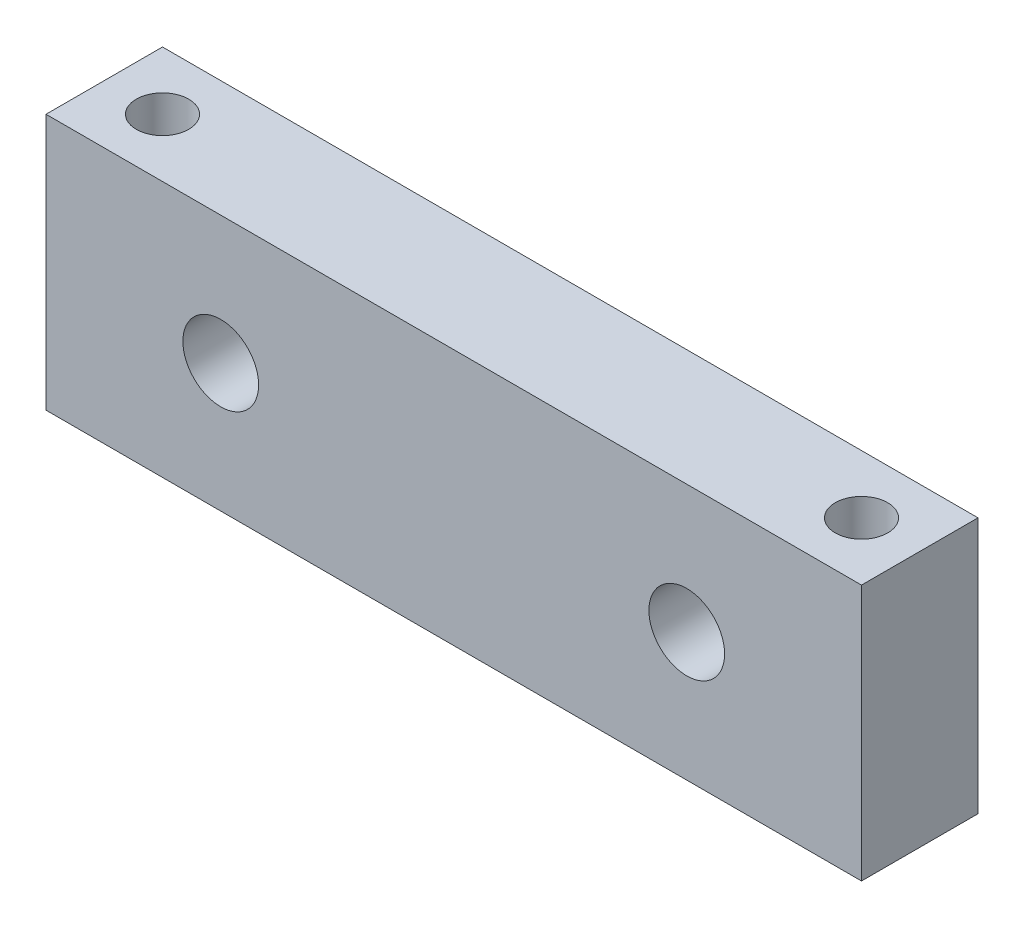
ISO-10303-21;
HEADER;
FILE_DESCRIPTION(('STEP AP214'),'2;1');
FILE_NAME('part.step','',(''),(''),'','','');
FILE_SCHEMA(('AUTOMOTIVE_DESIGN { 1 0 10303 214 1 1 1 1 }'));
ENDSEC;
DATA;
#1=APPLICATION_CONTEXT('core data for automotive mechanical design processes');
#2=APPLICATION_PROTOCOL_DEFINITION('international standard','automotive_design',2000,#1);
#3=PRODUCT_CONTEXT('',#1,'mechanical');
#4=PRODUCT('Part','Part','',(#3));
#5=PRODUCT_RELATED_PRODUCT_CATEGORY('part','',(#4));
#6=PRODUCT_DEFINITION_FORMATION('','',#4);
#7=PRODUCT_DEFINITION_CONTEXT('part definition',#1,'design');
#8=PRODUCT_DEFINITION('design','',#6,#7);
#9=PRODUCT_DEFINITION_SHAPE('','',#8);
#10=(LENGTH_UNIT() NAMED_UNIT(*) SI_UNIT(.MILLI.,.METRE.));
#11=(NAMED_UNIT(*) PLANE_ANGLE_UNIT() SI_UNIT($,.RADIAN.));
#12=(NAMED_UNIT(*) SI_UNIT($,.STERADIAN.) SOLID_ANGLE_UNIT());
#13=UNCERTAINTY_MEASURE_WITH_UNIT(LENGTH_MEASURE(1.E-05),#10,'distance_accuracy_value','');
#14=(GEOMETRIC_REPRESENTATION_CONTEXT(3) GLOBAL_UNCERTAINTY_ASSIGNED_CONTEXT((#13)) GLOBAL_UNIT_ASSIGNED_CONTEXT((#10,
#11,#12)) REPRESENTATION_CONTEXT('',''));
#15=CARTESIAN_POINT('',(0.,0.,0.));
#16=DIRECTION('',(0.,0.,1.));
#17=DIRECTION('',(1.,0.,0.));
#18=AXIS2_PLACEMENT_3D('',#15,#16,#17);
#19=CARTESIAN_POINT('',(30.,-34.,5.));
#20=DIRECTION('',(0.,1.,0.));
#21=DIRECTION('',(0.,0.,1.));
#22=AXIS2_PLACEMENT_3D('',#19,#20,#21);
#23=CYLINDRICAL_SURFACE('',#22,2.25);
#24=CARTESIAN_POINT('',(30.,11.,5.));
#25=DIRECTION('',(0.,1.,0.));
#26=DIRECTION('',(0.,0.,-1.));
#27=AXIS2_PLACEMENT_3D('',#24,#25,#26);
#28=CIRCLE('',#27,2.25);
#29=CARTESIAN_POINT('',(30.,11.,7.25));
#30=VERTEX_POINT('',#29);
#31=EDGE_CURVE('E188',#30,#30,#28,.T.);
#32=CARTESIAN_POINT('',(30.,-7.,5.));
#33=DIRECTION('',(0.,-1.,0.));
#34=DIRECTION('',(0.,0.,-1.));
#35=AXIS2_PLACEMENT_3D('',#32,#33,#34);
#36=CIRCLE('',#35,2.25);
#37=CARTESIAN_POINT('',(30.,-7.,7.25));
#38=VERTEX_POINT('',#37);
#39=EDGE_CURVE('E43',#38,#38,#36,.F.);
#40=CARTESIAN_POINT('',(30.,11.,7.25));
#41=CARTESIAN_POINT('',(30.,10.8125,7.25));
#42=CARTESIAN_POINT('',(30.,10.625,7.25));
#43=CARTESIAN_POINT('',(30.,10.25,7.25));
#44=CARTESIAN_POINT('',(30.,10.0625,7.25));
#45=CARTESIAN_POINT('',(30.,9.68749999999999,7.25));
#46=CARTESIAN_POINT('',(30.,9.49999999999999,7.25));
#47=CARTESIAN_POINT('',(30.,9.12499999999999,7.25));
#48=CARTESIAN_POINT('',(30.,8.93749999999999,7.25));
#49=CARTESIAN_POINT('',(30.,8.56249999999999,7.25));
#50=CARTESIAN_POINT('',(30.,8.375,7.25));
#51=CARTESIAN_POINT('',(30.,8.,7.25));
#52=CARTESIAN_POINT('',(30.,7.8125,7.25));
#53=CARTESIAN_POINT('',(30.,7.4375,7.25));
#54=CARTESIAN_POINT('',(30.,7.25,7.25));
#55=CARTESIAN_POINT('',(30.,6.875,7.25));
#56=CARTESIAN_POINT('',(30.,6.6875,7.25));
#57=CARTESIAN_POINT('',(30.,6.3125,7.25));
#58=CARTESIAN_POINT('',(30.,6.125,7.25));
#59=CARTESIAN_POINT('',(30.,5.75,7.25));
#60=CARTESIAN_POINT('',(30.,5.5625,7.25));
#61=CARTESIAN_POINT('',(30.,5.1875,7.25));
#62=CARTESIAN_POINT('',(30.,5.,7.25));
#63=CARTESIAN_POINT('',(30.,4.625,7.25));
#64=CARTESIAN_POINT('',(30.,4.4375,7.25));
#65=CARTESIAN_POINT('',(30.,4.0625,7.25));
#66=CARTESIAN_POINT('',(30.,3.875,7.25));
#67=CARTESIAN_POINT('',(30.,3.5,7.25));
#68=CARTESIAN_POINT('',(30.,3.3125,7.25));
#69=CARTESIAN_POINT('',(30.,2.9375,7.25));
#70=CARTESIAN_POINT('',(30.,2.75,7.25));
#71=CARTESIAN_POINT('',(30.,2.375,7.25));
#72=CARTESIAN_POINT('',(30.,2.1875,7.25));
#73=CARTESIAN_POINT('',(30.,1.8125,7.25));
#74=CARTESIAN_POINT('',(30.,1.625,7.25));
#75=CARTESIAN_POINT('',(30.,1.25,7.25));
#76=CARTESIAN_POINT('',(30.,1.0625,7.25));
#77=CARTESIAN_POINT('',(30.,0.687500000000001,7.25));
#78=CARTESIAN_POINT('',(30.,0.5,7.25));
#79=CARTESIAN_POINT('',(30.,0.125,7.25));
#80=CARTESIAN_POINT('',(30.,-0.0625,7.25));
#81=CARTESIAN_POINT('',(30.,-0.4375,7.25));
#82=CARTESIAN_POINT('',(30.,-0.625000000000001,7.25));
#83=CARTESIAN_POINT('',(30.,-1.,7.25));
#84=CARTESIAN_POINT('',(30.,-1.1875,7.25));
#85=CARTESIAN_POINT('',(30.,-1.5625,7.25));
#86=CARTESIAN_POINT('',(30.,-1.75,7.25));
#87=CARTESIAN_POINT('',(30.,-2.125,7.25));
#88=CARTESIAN_POINT('',(30.,-2.3125,7.25));
#89=CARTESIAN_POINT('',(30.,-2.6875,7.25));
#90=CARTESIAN_POINT('',(30.,-2.875,7.25));
#91=CARTESIAN_POINT('',(30.,-3.25,7.25));
#92=CARTESIAN_POINT('',(30.,-3.4375,7.25));
#93=CARTESIAN_POINT('',(30.,-3.8125,7.25));
#94=CARTESIAN_POINT('',(30.,-4.,7.25));
#95=CARTESIAN_POINT('',(30.,-4.375,7.25));
#96=CARTESIAN_POINT('',(30.,-4.5625,7.25));
#97=CARTESIAN_POINT('',(30.,-4.9375,7.25));
#98=CARTESIAN_POINT('',(30.,-5.125,7.25));
#99=CARTESIAN_POINT('',(30.,-5.5,7.25));
#100=CARTESIAN_POINT('',(30.,-5.6875,7.25));
#101=CARTESIAN_POINT('',(30.,-6.06249999999999,7.25));
#102=CARTESIAN_POINT('',(30.,-6.25,7.25));
#103=CARTESIAN_POINT('',(30.,-6.625,7.25));
#104=CARTESIAN_POINT('',(30.,-6.8125,7.25));
#105=CARTESIAN_POINT('',(30.,-7.,7.25));
#106=B_SPLINE_CURVE_WITH_KNOTS('',3,(#40,#41,#42,#43,#44,#45,#46,#47,#48,#49,#50,#51,#52,#53,
#54,#55,#56,#57,#58,#59,#60,#61,#62,#63,#64,#65,#66,#67,#68,#69,#70,#71,#72,#73,#74,#75,#76,#77,
#78,#79,#80,#81,#82,#83,#84,#85,#86,#87,#88,#89,#90,#91,#92,#93,#94,#95,#96,#97,#98,#99,#100,
#101,#102,#103,#104,#105),.UNSPECIFIED.,.F.,.F.,(4,2,2,2,2,2,2,2,2,2,2,2,2,2,2,2,2,2,2,2,2,2,2,
2,2,2,2,2,2,2,2,2,4),(0.,0.5625,1.125,1.6875,2.25,2.8125,3.375,3.9375,4.5,5.0625,5.625,6.1875,
6.75,7.3125,7.875,8.4375,8.99999999999999,9.5625,10.125,10.6875,11.25,11.8125,12.375,12.9375,
13.5,14.0625,14.625,15.1875,15.75,16.3125,16.875,17.4375,18.),.UNSPECIFIED.);
#107=EDGE_CURVE('BSEAM39',#30,#38,#106,.T.);
#108=ORIENTED_EDGE('',*,*,#31,.T.);
#109=ORIENTED_EDGE('',*,*,#39,.F.);
#110=ORIENTED_EDGE('',*,*,#107,.T.);
#111=ORIENTED_EDGE('',*,*,#107,.F.);
#112=EDGE_LOOP('',(#108,#110,#109,#111));
#113=FACE_BOUND('',#112,.T.);
#114=ADVANCED_FACE('F39',(#113),#23,.F.);
#115=CARTESIAN_POINT('',(-30.,-34.,5.));
#116=DIRECTION('',(0.,1.,0.));
#117=DIRECTION('',(0.,0.,1.));
#118=AXIS2_PLACEMENT_3D('',#115,#116,#117);
#119=CYLINDRICAL_SURFACE('',#118,2.25);
#120=CARTESIAN_POINT('',(-30.,11.,5.));
#121=DIRECTION('',(0.,1.,0.));
#122=DIRECTION('',(0.,0.,1.));
#123=AXIS2_PLACEMENT_3D('',#120,#121,#122);
#124=CIRCLE('',#123,2.25);
#125=CARTESIAN_POINT('',(-30.,11.,7.25));
#126=VERTEX_POINT('',#125);
#127=EDGE_CURVE('E115',#126,#126,#124,.T.);
#128=CARTESIAN_POINT('',(-30.,-7.,5.));
#129=DIRECTION('',(0.,-1.,0.));
#130=DIRECTION('',(0.,0.,-1.));
#131=AXIS2_PLACEMENT_3D('',#128,#129,#130);
#132=CIRCLE('',#131,2.25);
#133=CARTESIAN_POINT('',(-30.,-7.,7.25));
#134=VERTEX_POINT('',#133);
#135=EDGE_CURVE('E125',#134,#134,#132,.F.);
#136=CARTESIAN_POINT('',(-30.,11.,7.25));
#137=CARTESIAN_POINT('',(-30.,10.8125,7.25));
#138=CARTESIAN_POINT('',(-30.,10.625,7.25));
#139=CARTESIAN_POINT('',(-30.,10.25,7.25));
#140=CARTESIAN_POINT('',(-30.,10.0625,7.25));
#141=CARTESIAN_POINT('',(-30.,9.68749999999999,7.25));
#142=CARTESIAN_POINT('',(-30.,9.49999999999999,7.25));
#143=CARTESIAN_POINT('',(-30.,9.12499999999999,7.25));
#144=CARTESIAN_POINT('',(-30.,8.93749999999999,7.25));
#145=CARTESIAN_POINT('',(-30.,8.56249999999999,7.25));
#146=CARTESIAN_POINT('',(-30.,8.375,7.25));
#147=CARTESIAN_POINT('',(-30.,8.,7.25));
#148=CARTESIAN_POINT('',(-30.,7.8125,7.25));
#149=CARTESIAN_POINT('',(-30.,7.4375,7.25));
#150=CARTESIAN_POINT('',(-30.,7.25,7.25));
#151=CARTESIAN_POINT('',(-30.,6.875,7.25));
#152=CARTESIAN_POINT('',(-30.,6.6875,7.25));
#153=CARTESIAN_POINT('',(-30.,6.3125,7.25));
#154=CARTESIAN_POINT('',(-30.,6.125,7.25));
#155=CARTESIAN_POINT('',(-30.,5.75,7.25));
#156=CARTESIAN_POINT('',(-30.,5.5625,7.25));
#157=CARTESIAN_POINT('',(-30.,5.1875,7.25));
#158=CARTESIAN_POINT('',(-30.,5.,7.25));
#159=CARTESIAN_POINT('',(-30.,4.625,7.25));
#160=CARTESIAN_POINT('',(-30.,4.4375,7.25));
#161=CARTESIAN_POINT('',(-30.,4.0625,7.25));
#162=CARTESIAN_POINT('',(-30.,3.875,7.25));
#163=CARTESIAN_POINT('',(-30.,3.5,7.25));
#164=CARTESIAN_POINT('',(-30.,3.3125,7.25));
#165=CARTESIAN_POINT('',(-30.,2.9375,7.25));
#166=CARTESIAN_POINT('',(-30.,2.75,7.25));
#167=CARTESIAN_POINT('',(-30.,2.375,7.25));
#168=CARTESIAN_POINT('',(-30.,2.1875,7.25));
#169=CARTESIAN_POINT('',(-30.,1.8125,7.25));
#170=CARTESIAN_POINT('',(-30.,1.625,7.25));
#171=CARTESIAN_POINT('',(-30.,1.25,7.25));
#172=CARTESIAN_POINT('',(-30.,1.0625,7.25));
#173=CARTESIAN_POINT('',(-30.,0.687500000000001,7.25));
#174=CARTESIAN_POINT('',(-30.,0.5,7.25));
#175=CARTESIAN_POINT('',(-30.,0.125,7.25));
#176=CARTESIAN_POINT('',(-30.,-0.0625,7.25));
#177=CARTESIAN_POINT('',(-30.,-0.4375,7.25));
#178=CARTESIAN_POINT('',(-30.,-0.625000000000001,7.25));
#179=CARTESIAN_POINT('',(-30.,-1.,7.25));
#180=CARTESIAN_POINT('',(-30.,-1.1875,7.25));
#181=CARTESIAN_POINT('',(-30.,-1.5625,7.25));
#182=CARTESIAN_POINT('',(-30.,-1.75,7.25));
#183=CARTESIAN_POINT('',(-30.,-2.125,7.25));
#184=CARTESIAN_POINT('',(-30.,-2.3125,7.25));
#185=CARTESIAN_POINT('',(-30.,-2.6875,7.25));
#186=CARTESIAN_POINT('',(-30.,-2.875,7.25));
#187=CARTESIAN_POINT('',(-30.,-3.25,7.25));
#188=CARTESIAN_POINT('',(-30.,-3.4375,7.25));
#189=CARTESIAN_POINT('',(-30.,-3.8125,7.25));
#190=CARTESIAN_POINT('',(-30.,-4.,7.25));
#191=CARTESIAN_POINT('',(-30.,-4.375,7.25));
#192=CARTESIAN_POINT('',(-30.,-4.5625,7.25));
#193=CARTESIAN_POINT('',(-30.,-4.9375,7.25));
#194=CARTESIAN_POINT('',(-30.,-5.125,7.25));
#195=CARTESIAN_POINT('',(-30.,-5.5,7.25));
#196=CARTESIAN_POINT('',(-30.,-5.6875,7.25));
#197=CARTESIAN_POINT('',(-30.,-6.06249999999999,7.25));
#198=CARTESIAN_POINT('',(-30.,-6.25,7.25));
#199=CARTESIAN_POINT('',(-30.,-6.625,7.25));
#200=CARTESIAN_POINT('',(-30.,-6.8125,7.25));
#201=CARTESIAN_POINT('',(-30.,-7.,7.25));
#202=B_SPLINE_CURVE_WITH_KNOTS('',3,(#136,#137,#138,#139,#140,#141,#142,#143,#144,#145,#146,
#147,#148,#149,#150,#151,#152,#153,#154,#155,#156,#157,#158,#159,#160,#161,#162,#163,#164,#165,
#166,#167,#168,#169,#170,#171,#172,#173,#174,#175,#176,#177,#178,#179,#180,#181,#182,#183,#184,
#185,#186,#187,#188,#189,#190,#191,#192,#193,#194,#195,#196,#197,#198,#199,#200,#201),
.UNSPECIFIED.,.F.,.F.,(4,2,2,2,2,2,2,2,2,2,2,2,2,2,2,2,2,2,2,2,2,2,2,2,2,2,2,2,2,2,2,2,4),(0.,
0.5625,1.125,1.6875,2.25,2.8125,3.375,3.9375,4.5,5.0625,5.625,6.1875,6.75,7.3125,7.875,8.4375,
8.99999999999999,9.5625,10.125,10.6875,11.25,11.8125,12.375,12.9375,13.5,14.0625,14.625,15.1875,
15.75,16.3125,16.875,17.4375,18.),.UNSPECIFIED.);
#203=EDGE_CURVE('BSEAM214',#126,#134,#202,.T.);
#204=ORIENTED_EDGE('',*,*,#127,.T.);
#205=ORIENTED_EDGE('',*,*,#135,.F.);
#206=ORIENTED_EDGE('',*,*,#203,.T.);
#207=ORIENTED_EDGE('',*,*,#203,.F.);
#208=EDGE_LOOP('',(#204,#206,#205,#207));
#209=FACE_BOUND('',#208,.T.);
#210=ADVANCED_FACE('F214',(#209),#119,.F.);
#211=CARTESIAN_POINT('',(0.,0.,0.));
#212=DIRECTION('',(0.,0.,-1.));
#213=DIRECTION('',(-1.,0.,0.));
#214=AXIS2_PLACEMENT_3D('',#211,#212,#213);
#215=PLANE('',#214);
#216=DIRECTION('',(0.,1.,0.));
#217=VECTOR('',#216,1.);
#218=CARTESIAN_POINT('',(35.,-11.,0.));
#219=LINE('',#218,#217);
#220=CARTESIAN_POINT('',(35.,-11.,0.));
#221=VERTEX_POINT('',#220);
#222=CARTESIAN_POINT('',(35.,11.,0.));
#223=VERTEX_POINT('',#222);
#224=EDGE_CURVE('E111',#221,#223,#219,.T.);
#225=ORIENTED_EDGE('',*,*,#224,.F.);
#226=DIRECTION('',(1.,0.,0.));
#227=VECTOR('',#226,1.);
#228=CARTESIAN_POINT('',(-35.,-11.,0.));
#229=LINE('',#228,#227);
#230=CARTESIAN_POINT('',(-35.,-11.,0.));
#231=VERTEX_POINT('',#230);
#232=EDGE_CURVE('E82',#231,#221,#229,.T.);
#233=ORIENTED_EDGE('',*,*,#232,.F.);
#234=DIRECTION('',(0.,-1.,0.));
#235=VECTOR('',#234,1.);
#236=CARTESIAN_POINT('',(-35.,-11.,0.));
#237=LINE('',#236,#235);
#238=CARTESIAN_POINT('',(-35.,11.,0.));
#239=VERTEX_POINT('',#238);
#240=EDGE_CURVE('E76',#239,#231,#237,.T.);
#241=ORIENTED_EDGE('',*,*,#240,.F.);
#242=DIRECTION('',(-1.,0.,0.));
#243=VECTOR('',#242,1.);
#244=CARTESIAN_POINT('',(-35.,11.,0.));
#245=LINE('',#244,#243);
#246=EDGE_CURVE('E99',#223,#239,#245,.T.);
#247=ORIENTED_EDGE('',*,*,#246,.F.);
#248=EDGE_LOOP('',(#225,#233,#241,#247));
#249=FACE_BOUND('',#248,.T.);
#250=CARTESIAN_POINT('',(20.,0.,0.));
#251=DIRECTION('',(0.,0.,-1.));
#252=DIRECTION('',(-1.,0.,0.));
#253=AXIS2_PLACEMENT_3D('',#250,#251,#252);
#254=CIRCLE('',#253,5.19957386363639);
#255=CARTESIAN_POINT('',(14.8004261363636,0.,0.));
#256=VERTEX_POINT('',#255);
#257=EDGE_CURVE('E168',#256,#256,#254,.T.);
#258=ORIENTED_EDGE('',*,*,#257,.F.);
#259=EDGE_LOOP('',(#258));
#260=FACE_BOUND('',#259,.T.);
#261=CARTESIAN_POINT('',(-20.,0.,0.));
#262=DIRECTION('',(0.,0.,-1.));
#263=DIRECTION('',(-1.,0.,0.));
#264=AXIS2_PLACEMENT_3D('',#261,#262,#263);
#265=CIRCLE('',#264,5.25);
#266=CARTESIAN_POINT('',(-25.25,0.,0.));
#267=VERTEX_POINT('',#266);
#268=EDGE_CURVE('E155',#267,#267,#265,.T.);
#269=ORIENTED_EDGE('',*,*,#268,.F.);
#270=EDGE_LOOP('',(#269));
#271=FACE_BOUND('',#270,.T.);
#272=ADVANCED_FACE('F210',(#249,#260,#271),#215,.T.);
#273=CARTESIAN_POINT('',(35.,-11.,10.));
#274=DIRECTION('',(-1.,0.,0.));
#275=DIRECTION('',(0.,0.,1.));
#276=AXIS2_PLACEMENT_3D('',#273,#274,#275);
#277=PLANE('',#276);
#278=ORIENTED_EDGE('',*,*,#224,.T.);
#279=DIRECTION('',(0.,0.,-1.));
#280=VECTOR('',#279,1.);
#281=CARTESIAN_POINT('',(35.,11.,10.));
#282=LINE('',#281,#280);
#283=CARTESIAN_POINT('',(35.,11.,10.));
#284=VERTEX_POINT('',#283);
#285=EDGE_CURVE('E11',#284,#223,#282,.T.);
#286=ORIENTED_EDGE('',*,*,#285,.F.);
#287=DIRECTION('',(0.,1.,0.));
#288=VECTOR('',#287,1.);
#289=CARTESIAN_POINT('',(35.,-11.,10.));
#290=LINE('',#289,#288);
#291=CARTESIAN_POINT('',(35.,-11.,10.));
#292=VERTEX_POINT('',#291);
#293=EDGE_CURVE('E94',#292,#284,#290,.T.);
#294=ORIENTED_EDGE('',*,*,#293,.F.);
#295=DIRECTION('',(0.,0.,-1.));
#296=VECTOR('',#295,1.);
#297=CARTESIAN_POINT('',(35.,-11.,10.));
#298=LINE('',#297,#296);
#299=EDGE_CURVE('E107',#292,#221,#298,.T.);
#300=ORIENTED_EDGE('',*,*,#299,.T.);
#301=EDGE_LOOP('',(#278,#286,#294,#300));
#302=FACE_BOUND('',#301,.T.);
#303=ADVANCED_FACE('F41',(#302),#277,.F.);
#304=CARTESIAN_POINT('',(-35.,11.,10.));
#305=DIRECTION('',(0.,-1.,0.));
#306=DIRECTION('',(0.,0.,-1.));
#307=AXIS2_PLACEMENT_3D('',#304,#305,#306);
#308=PLANE('',#307);
#309=ORIENTED_EDGE('',*,*,#127,.F.);
#310=EDGE_LOOP('',(#309));
#311=FACE_BOUND('',#310,.T.);
#312=ORIENTED_EDGE('',*,*,#31,.F.);
#313=EDGE_LOOP('',(#312));
#314=FACE_BOUND('',#313,.T.);
#315=ORIENTED_EDGE('',*,*,#246,.T.);
#316=DIRECTION('',(0.,0.,-1.));
#317=VECTOR('',#316,1.);
#318=CARTESIAN_POINT('',(-35.,11.,10.));
#319=LINE('',#318,#317);
#320=CARTESIAN_POINT('',(-35.,11.,10.));
#321=VERTEX_POINT('',#320);
#322=EDGE_CURVE('E50',#321,#239,#319,.T.);
#323=ORIENTED_EDGE('',*,*,#322,.F.);
#324=DIRECTION('',(-1.,0.,0.));
#325=VECTOR('',#324,1.);
#326=CARTESIAN_POINT('',(-35.,11.,10.));
#327=LINE('',#326,#325);
#328=EDGE_CURVE('E89',#284,#321,#327,.T.);
#329=ORIENTED_EDGE('',*,*,#328,.F.);
#330=ORIENTED_EDGE('',*,*,#285,.T.);
#331=EDGE_LOOP('',(#315,#323,#329,#330));
#332=FACE_BOUND('',#331,.T.);
#333=ADVANCED_FACE('F98',(#311,#314,#332),#308,.F.);
#334=CARTESIAN_POINT('',(-35.,-11.,10.));
#335=DIRECTION('',(1.,0.,0.));
#336=DIRECTION('',(0.,0.,-1.));
#337=AXIS2_PLACEMENT_3D('',#334,#335,#336);
#338=PLANE('',#337);
#339=ORIENTED_EDGE('',*,*,#240,.T.);
#340=DIRECTION('',(0.,0.,-1.));
#341=VECTOR('',#340,1.);
#342=CARTESIAN_POINT('',(-35.,-11.,10.));
#343=LINE('',#342,#341);
#344=CARTESIAN_POINT('',(-35.,-11.,10.));
#345=VERTEX_POINT('',#344);
#346=EDGE_CURVE('E101',#345,#231,#343,.T.);
#347=ORIENTED_EDGE('',*,*,#346,.F.);
#348=DIRECTION('',(0.,-1.,0.));
#349=VECTOR('',#348,1.);
#350=CARTESIAN_POINT('',(-35.,-11.,10.));
#351=LINE('',#350,#349);
#352=EDGE_CURVE('E92',#321,#345,#351,.T.);
#353=ORIENTED_EDGE('',*,*,#352,.F.);
#354=ORIENTED_EDGE('',*,*,#322,.T.);
#355=EDGE_LOOP('',(#339,#347,#353,#354));
#356=FACE_BOUND('',#355,.T.);
#357=ADVANCED_FACE('F103',(#356),#338,.F.);
#358=CARTESIAN_POINT('',(-35.,-11.,10.));
#359=DIRECTION('',(0.,1.,0.));
#360=DIRECTION('',(0.,0.,1.));
#361=AXIS2_PLACEMENT_3D('',#358,#359,#360);
#362=PLANE('',#361);
#363=CARTESIAN_POINT('',(30.,-11.,5.00000000000003));
#364=DIRECTION('',(0.,-1.,0.));
#365=DIRECTION('',(0.,0.,-1.));
#366=AXIS2_PLACEMENT_3D('',#363,#364,#365);
#367=CIRCLE('',#366,4.00000000000001);
#368=CARTESIAN_POINT('',(30.,-11.,1.00000000000003));
#369=VERTEX_POINT('',#368);
#370=EDGE_CURVE('E136',#369,#369,#367,.T.);
#371=ORIENTED_EDGE('',*,*,#370,.F.);
#372=EDGE_LOOP('',(#371));
#373=FACE_BOUND('',#372,.T.);
#374=CARTESIAN_POINT('',(-30.,-11.,5.));
#375=DIRECTION('',(0.,-1.,0.));
#376=DIRECTION('',(0.,0.,-1.));
#377=AXIS2_PLACEMENT_3D('',#374,#375,#376);
#378=CIRCLE('',#377,4.);
#379=CARTESIAN_POINT('',(-30.,-11.,1.));
#380=VERTEX_POINT('',#379);
#381=EDGE_CURVE('E148',#380,#380,#378,.T.);
#382=ORIENTED_EDGE('',*,*,#381,.F.);
#383=EDGE_LOOP('',(#382));
#384=FACE_BOUND('',#383,.T.);
#385=ORIENTED_EDGE('',*,*,#232,.T.);
#386=ORIENTED_EDGE('',*,*,#299,.F.);
#387=DIRECTION('',(1.,0.,0.));
#388=VECTOR('',#387,1.);
#389=CARTESIAN_POINT('',(-35.,-11.,10.));
#390=LINE('',#389,#388);
#391=EDGE_CURVE('E59',#345,#292,#390,.T.);
#392=ORIENTED_EDGE('',*,*,#391,.F.);
#393=ORIENTED_EDGE('',*,*,#346,.T.);
#394=EDGE_LOOP('',(#385,#386,#392,#393));
#395=FACE_BOUND('',#394,.T.);
#396=ADVANCED_FACE('F208',(#373,#384,#395),#362,.F.);
#397=CARTESIAN_POINT('',(0.,0.,10.));
#398=DIRECTION('',(0.,0.,-1.));
#399=DIRECTION('',(-1.,0.,0.));
#400=AXIS2_PLACEMENT_3D('',#397,#398,#399);
#401=PLANE('',#400);
#402=CARTESIAN_POINT('',(20.,0.,10.));
#403=DIRECTION('',(0.,0.,1.));
#404=DIRECTION('',(1.,0.,0.));
#405=AXIS2_PLACEMENT_3D('',#402,#403,#404);
#406=CIRCLE('',#405,3.25);
#407=CARTESIAN_POINT('',(23.25,0.,9.99999999999999));
#408=VERTEX_POINT('',#407);
#409=EDGE_CURVE('E184',#408,#408,#406,.T.);
#410=ORIENTED_EDGE('',*,*,#409,.F.);
#411=EDGE_LOOP('',(#410));
#412=FACE_BOUND('',#411,.T.);
#413=CARTESIAN_POINT('',(-20.,0.,10.));
#414=DIRECTION('',(0.,0.,1.));
#415=DIRECTION('',(-1.,0.,0.));
#416=AXIS2_PLACEMENT_3D('',#413,#414,#415);
#417=CIRCLE('',#416,3.25);
#418=CARTESIAN_POINT('',(-16.75,0.,9.99999999999999));
#419=VERTEX_POINT('',#418);
#420=EDGE_CURVE('E183',#419,#419,#417,.T.);
#421=ORIENTED_EDGE('',*,*,#420,.F.);
#422=EDGE_LOOP('',(#421));
#423=FACE_BOUND('',#422,.T.);
#424=ORIENTED_EDGE('',*,*,#293,.T.);
#425=ORIENTED_EDGE('',*,*,#328,.T.);
#426=ORIENTED_EDGE('',*,*,#352,.T.);
#427=ORIENTED_EDGE('',*,*,#391,.T.);
#428=EDGE_LOOP('',(#424,#425,#426,#427));
#429=FACE_BOUND('',#428,.T.);
#430=ADVANCED_FACE('F90',(#412,#423,#429),#401,.F.);
#431=CARTESIAN_POINT('',(-20.,0.,-35.));
#432=DIRECTION('',(0.,0.,1.));
#433=DIRECTION('',(1.,0.,0.));
#434=AXIS2_PLACEMENT_3D('',#431,#432,#433);
#435=CYLINDRICAL_SURFACE('',#434,3.25);
#436=CARTESIAN_POINT('',(-20.,0.,-4.));
#437=DIRECTION('',(0.,0.,-1.));
#438=DIRECTION('',(-1.,0.,0.));
#439=AXIS2_PLACEMENT_3D('',#436,#437,#438);
#440=CIRCLE('',#439,3.25);
#441=CARTESIAN_POINT('',(-16.75,0.,-4.));
#442=VERTEX_POINT('',#441);
#443=EDGE_CURVE('E134',#442,#442,#440,.T.);
#444=CARTESIAN_POINT('',(-16.75,0.,9.99999999999999));
#445=CARTESIAN_POINT('',(-16.75,0.,9.85416666666666));
#446=CARTESIAN_POINT('',(-16.75,0.,9.70833333333333));
#447=CARTESIAN_POINT('',(-16.75,0.,9.41666666666666));
#448=CARTESIAN_POINT('',(-16.75,0.,9.27083333333333));
#449=CARTESIAN_POINT('',(-16.75,0.,8.97916666666666));
#450=CARTESIAN_POINT('',(-16.75,0.,8.83333333333333));
#451=CARTESIAN_POINT('',(-16.75,0.,8.54166666666666));
#452=CARTESIAN_POINT('',(-16.75,0.,8.39583333333333));
#453=CARTESIAN_POINT('',(-16.75,0.,8.10416666666666));
#454=CARTESIAN_POINT('',(-16.75,0.,7.95833333333333));
#455=CARTESIAN_POINT('',(-16.75,0.,7.66666666666666));
#456=CARTESIAN_POINT('',(-16.75,0.,7.52083333333333));
#457=CARTESIAN_POINT('',(-16.75,0.,7.22916666666666));
#458=CARTESIAN_POINT('',(-16.75,0.,7.08333333333333));
#459=CARTESIAN_POINT('',(-16.75,0.,6.79166666666666));
#460=CARTESIAN_POINT('',(-16.75,0.,6.64583333333333));
#461=CARTESIAN_POINT('',(-16.75,0.,6.35416666666666));
#462=CARTESIAN_POINT('',(-16.75,0.,6.20833333333333));
#463=CARTESIAN_POINT('',(-16.75,0.,5.91666666666666));
#464=CARTESIAN_POINT('',(-16.75,0.,5.77083333333333));
#465=CARTESIAN_POINT('',(-16.75,0.,5.47916666666666));
#466=CARTESIAN_POINT('',(-16.75,0.,5.33333333333333));
#467=CARTESIAN_POINT('',(-16.75,0.,5.04166666666666));
#468=CARTESIAN_POINT('',(-16.75,0.,4.89583333333333));
#469=CARTESIAN_POINT('',(-16.75,0.,4.60416666666666));
#470=CARTESIAN_POINT('',(-16.75,0.,4.45833333333333));
#471=CARTESIAN_POINT('',(-16.75,0.,4.16666666666666));
#472=CARTESIAN_POINT('',(-16.75,0.,4.02083333333333));
#473=CARTESIAN_POINT('',(-16.75,0.,3.72916666666666));
#474=CARTESIAN_POINT('',(-16.75,0.,3.58333333333333));
#475=CARTESIAN_POINT('',(-16.75,0.,3.29166666666666));
#476=CARTESIAN_POINT('',(-16.75,0.,3.14583333333333));
#477=CARTESIAN_POINT('',(-16.75,0.,2.85416666666666));
#478=CARTESIAN_POINT('',(-16.75,0.,2.70833333333333));
#479=CARTESIAN_POINT('',(-16.75,0.,2.41666666666666));
#480=CARTESIAN_POINT('',(-16.75,0.,2.27083333333333));
#481=CARTESIAN_POINT('',(-16.75,0.,1.97916666666666));
#482=CARTESIAN_POINT('',(-16.75,0.,1.83333333333333));
#483=CARTESIAN_POINT('',(-16.75,0.,1.54166666666666));
#484=CARTESIAN_POINT('',(-16.75,0.,1.39583333333333));
#485=CARTESIAN_POINT('',(-16.75,0.,1.10416666666666));
#486=CARTESIAN_POINT('',(-16.75,0.,0.958333333333327));
#487=CARTESIAN_POINT('',(-16.75,0.,0.666666666666663));
#488=CARTESIAN_POINT('',(-16.75,0.,0.520833333333331));
#489=CARTESIAN_POINT('',(-16.75,0.,0.229166666666665));
#490=CARTESIAN_POINT('',(-16.75,0.,0.0833333333333288));
#491=CARTESIAN_POINT('',(-16.75,0.,-0.208333333333338));
#492=CARTESIAN_POINT('',(-16.75,0.,-0.354166666666669));
#493=CARTESIAN_POINT('',(-16.75,0.,-0.645833333333336));
#494=CARTESIAN_POINT('',(-16.75,0.,-0.791666666666672));
#495=CARTESIAN_POINT('',(-16.75,0.,-1.08333333333334));
#496=CARTESIAN_POINT('',(-16.75,0.,-1.22916666666667));
#497=CARTESIAN_POINT('',(-16.75,0.,-1.52083333333333));
#498=CARTESIAN_POINT('',(-16.75,0.,-1.66666666666667));
#499=CARTESIAN_POINT('',(-16.75,0.,-1.95833333333334));
#500=CARTESIAN_POINT('',(-16.75,0.,-2.10416666666667));
#501=CARTESIAN_POINT('',(-16.75,0.,-2.39583333333334));
#502=CARTESIAN_POINT('',(-16.75,0.,-2.54166666666667));
#503=CARTESIAN_POINT('',(-16.75,0.,-2.83333333333334));
#504=CARTESIAN_POINT('',(-16.75,0.,-2.97916666666667));
#505=CARTESIAN_POINT('',(-16.75,0.,-3.27083333333334));
#506=CARTESIAN_POINT('',(-16.75,0.,-3.41666666666667));
#507=CARTESIAN_POINT('',(-16.75,0.,-3.70833333333334));
#508=CARTESIAN_POINT('',(-16.75,0.,-3.85416666666667));
#509=CARTESIAN_POINT('',(-16.75,0.,-4.));
#510=B_SPLINE_CURVE_WITH_KNOTS('',3,(#444,#445,#446,#447,#448,#449,#450,#451,#452,#453,#454,
#455,#456,#457,#458,#459,#460,#461,#462,#463,#464,#465,#466,#467,#468,#469,#470,#471,#472,#473,
#474,#475,#476,#477,#478,#479,#480,#481,#482,#483,#484,#485,#486,#487,#488,#489,#490,#491,#492,
#493,#494,#495,#496,#497,#498,#499,#500,#501,#502,#503,#504,#505,#506,#507,#508,#509),
.UNSPECIFIED.,.F.,.F.,(4,2,2,2,2,2,2,2,2,2,2,2,2,2,2,2,2,2,2,2,2,2,2,2,2,2,2,2,2,2,2,2,4),(0.,
0.4375,0.875000000000001,1.3125,1.75,2.1875,2.625,3.0625,3.5,3.9375,4.375,4.8125,5.25,5.6875,
6.125,6.5625,7.,7.4375,7.875,8.3125,8.75,9.1875,9.62499999999999,10.0625,10.5,10.9375,11.375,
11.8125,12.25,12.6875,13.125,13.5625,14.),.UNSPECIFIED.);
#511=EDGE_CURVE('BSEAM225',#419,#442,#510,.T.);
#512=ORIENTED_EDGE('',*,*,#420,.T.);
#513=ORIENTED_EDGE('',*,*,#443,.T.);
#514=ORIENTED_EDGE('',*,*,#511,.T.);
#515=ORIENTED_EDGE('',*,*,#511,.F.);
#516=EDGE_LOOP('',(#512,#514,#513,#515));
#517=FACE_BOUND('',#516,.T.);
#518=ADVANCED_FACE('F225',(#517),#435,.F.);
#519=CARTESIAN_POINT('',(20.,0.,-35.));
#520=DIRECTION('',(0.,0.,1.));
#521=DIRECTION('',(1.,0.,0.));
#522=AXIS2_PLACEMENT_3D('',#519,#520,#521);
#523=CYLINDRICAL_SURFACE('',#522,3.25);
#524=CARTESIAN_POINT('',(20.,0.,0.));
#525=DIRECTION('',(0.,0.,-1.));
#526=DIRECTION('',(-1.,0.,0.));
#527=AXIS2_PLACEMENT_3D('',#524,#525,#526);
#528=CIRCLE('',#527,3.25);
#529=CARTESIAN_POINT('',(23.25,0.,0.));
#530=VERTEX_POINT('',#529);
#531=EDGE_CURVE('E176',#530,#530,#528,.F.);
#532=CARTESIAN_POINT('',(23.25,0.,0.));
#533=CARTESIAN_POINT('',(23.25,0.,0.104166666666667));
#534=CARTESIAN_POINT('',(23.25,0.,0.208333333333334));
#535=CARTESIAN_POINT('',(23.25,0.,0.416666666666667));
#536=CARTESIAN_POINT('',(23.25,0.,0.520833333333334));
#537=CARTESIAN_POINT('',(23.25,0.,0.729166666666667));
#538=CARTESIAN_POINT('',(23.25,0.,0.833333333333334));
#539=CARTESIAN_POINT('',(23.25,0.,1.04166666666667));
#540=CARTESIAN_POINT('',(23.25,0.,1.14583333333333));
#541=CARTESIAN_POINT('',(23.25,0.,1.35416666666667));
#542=CARTESIAN_POINT('',(23.25,0.,1.45833333333333));
#543=CARTESIAN_POINT('',(23.25,0.,1.66666666666667));
#544=CARTESIAN_POINT('',(23.25,0.,1.77083333333334));
#545=CARTESIAN_POINT('',(23.25,0.,1.97916666666667));
#546=CARTESIAN_POINT('',(23.25,0.,2.08333333333334));
#547=CARTESIAN_POINT('',(23.25,0.,2.29166666666667));
#548=CARTESIAN_POINT('',(23.25,0.,2.39583333333334));
#549=CARTESIAN_POINT('',(23.25,0.,2.60416666666667));
#550=CARTESIAN_POINT('',(23.25,0.,2.70833333333333));
#551=CARTESIAN_POINT('',(23.25,0.,2.91666666666666));
#552=CARTESIAN_POINT('',(23.25,0.,3.02083333333333));
#553=CARTESIAN_POINT('',(23.25,0.,3.22916666666666));
#554=CARTESIAN_POINT('',(23.25,0.,3.33333333333333));
#555=CARTESIAN_POINT('',(23.25,0.,3.54166666666666));
#556=CARTESIAN_POINT('',(23.25,0.,3.64583333333333));
#557=CARTESIAN_POINT('',(23.25,0.,3.85416666666666));
#558=CARTESIAN_POINT('',(23.25,0.,3.95833333333333));
#559=CARTESIAN_POINT('',(23.25,0.,4.16666666666666));
#560=CARTESIAN_POINT('',(23.25,0.,4.27083333333333));
#561=CARTESIAN_POINT('',(23.25,0.,4.47916666666666));
#562=CARTESIAN_POINT('',(23.25,0.,4.58333333333333));
#563=CARTESIAN_POINT('',(23.25,0.,4.79166666666666));
#564=CARTESIAN_POINT('',(23.25,0.,4.89583333333333));
#565=CARTESIAN_POINT('',(23.25,0.,5.10416666666666));
#566=CARTESIAN_POINT('',(23.25,0.,5.20833333333333));
#567=CARTESIAN_POINT('',(23.25,0.,5.41666666666666));
#568=CARTESIAN_POINT('',(23.25,0.,5.52083333333333));
#569=CARTESIAN_POINT('',(23.25,0.,5.72916666666666));
#570=CARTESIAN_POINT('',(23.25,0.,5.83333333333333));
#571=CARTESIAN_POINT('',(23.25,0.,6.04166666666667));
#572=CARTESIAN_POINT('',(23.25,0.,6.14583333333333));
#573=CARTESIAN_POINT('',(23.25,0.,6.35416666666667));
#574=CARTESIAN_POINT('',(23.25,0.,6.45833333333333));
#575=CARTESIAN_POINT('',(23.25,0.,6.66666666666667));
#576=CARTESIAN_POINT('',(23.25,0.,6.77083333333333));
#577=CARTESIAN_POINT('',(23.25,0.,6.97916666666667));
#578=CARTESIAN_POINT('',(23.25,0.,7.08333333333333));
#579=CARTESIAN_POINT('',(23.25,0.,7.29166666666666));
#580=CARTESIAN_POINT('',(23.25,0.,7.39583333333333));
#581=CARTESIAN_POINT('',(23.25,0.,7.60416666666666));
#582=CARTESIAN_POINT('',(23.25,0.,7.70833333333333));
#583=CARTESIAN_POINT('',(23.25,0.,7.91666666666666));
#584=CARTESIAN_POINT('',(23.25,0.,8.02083333333333));
#585=CARTESIAN_POINT('',(23.25,0.,8.22916666666666));
#586=CARTESIAN_POINT('',(23.25,0.,8.33333333333333));
#587=CARTESIAN_POINT('',(23.25,0.,8.54166666666666));
#588=CARTESIAN_POINT('',(23.25,0.,8.64583333333333));
#589=CARTESIAN_POINT('',(23.25,0.,8.85416666666666));
#590=CARTESIAN_POINT('',(23.25,0.,8.95833333333333));
#591=CARTESIAN_POINT('',(23.25,0.,9.16666666666666));
#592=CARTESIAN_POINT('',(23.25,0.,9.27083333333333));
#593=CARTESIAN_POINT('',(23.25,0.,9.47916666666666));
#594=CARTESIAN_POINT('',(23.25,0.,9.58333333333333));
#595=CARTESIAN_POINT('',(23.25,0.,9.79166666666666));
#596=CARTESIAN_POINT('',(23.25,0.,9.89583333333333));
#597=CARTESIAN_POINT('',(23.25,0.,9.99999999999999));
#598=B_SPLINE_CURVE_WITH_KNOTS('',3,(#532,#533,#534,#535,#536,#537,#538,#539,#540,#541,#542,
#543,#544,#545,#546,#547,#548,#549,#550,#551,#552,#553,#554,#555,#556,#557,#558,#559,#560,#561,
#562,#563,#564,#565,#566,#567,#568,#569,#570,#571,#572,#573,#574,#575,#576,#577,#578,#579,#580,
#581,#582,#583,#584,#585,#586,#587,#588,#589,#590,#591,#592,#593,#594,#595,#596,#597),
.UNSPECIFIED.,.F.,.F.,(4,2,2,2,2,2,2,2,2,2,2,2,2,2,2,2,2,2,2,2,2,2,2,2,2,2,2,2,2,2,2,2,4),(0.,
0.3125,0.625000000000001,0.937500000000001,1.25,1.5625,1.875,2.1875,2.5,2.8125,3.125,3.4375,
3.75,4.0625,4.375,4.6875,5.,5.3125,5.625,5.9375,6.25,6.5625,6.875,7.1875,7.49999999999999,
7.8125,8.12499999999999,8.43749999999999,8.74999999999999,9.06249999999999,9.37499999999999,
9.68749999999999,9.99999999999999),.UNSPECIFIED.);
#599=EDGE_CURVE('BSEAM275',#530,#408,#598,.T.);
#600=ORIENTED_EDGE('',*,*,#531,.F.);
#601=ORIENTED_EDGE('',*,*,#409,.T.);
#602=ORIENTED_EDGE('',*,*,#599,.T.);
#603=ORIENTED_EDGE('',*,*,#599,.F.);
#604=EDGE_LOOP('',(#600,#602,#601,#603));
#605=FACE_BOUND('',#604,.T.);
#606=ADVANCED_FACE('F275',(#605),#523,.F.);
#607=CARTESIAN_POINT('',(20.,0.,0.));
#608=DIRECTION('',(0.,0.,-1.));
#609=DIRECTION('',(-1.,0.,0.));
#610=AXIS2_PLACEMENT_3D('',#607,#608,#609);
#611=PLANE('',#610);
#612=CARTESIAN_POINT('',(20.,0.,0.));
#613=DIRECTION('',(0.,0.,-1.));
#614=DIRECTION('',(-1.,0.,0.));
#615=AXIS2_PLACEMENT_3D('',#612,#613,#614);
#616=CIRCLE('',#615,3.19957386363639);
#617=CARTESIAN_POINT('',(16.8004261363636,0.,0.));
#618=VERTEX_POINT('',#617);
#619=EDGE_CURVE('E160',#618,#618,#616,.T.);
#620=ORIENTED_EDGE('',*,*,#619,.T.);
#621=EDGE_LOOP('',(#620));
#622=FACE_BOUND('',#621,.T.);
#623=ORIENTED_EDGE('',*,*,#531,.T.);
#624=EDGE_LOOP('',(#623));
#625=FACE_BOUND('',#624,.T.);
#626=ADVANCED_FACE('F271',(#622,#625),#611,.F.);
#627=CARTESIAN_POINT('',(20.,0.,-4.));
#628=DIRECTION('',(0.,0.,-1.));
#629=DIRECTION('',(-1.,0.,0.));
#630=AXIS2_PLACEMENT_3D('',#627,#628,#629);
#631=PLANE('',#630);
#632=CARTESIAN_POINT('',(20.,0.,-4.));
#633=DIRECTION('',(0.,0.,-1.));
#634=DIRECTION('',(-1.,0.,0.));
#635=AXIS2_PLACEMENT_3D('',#632,#633,#634);
#636=CIRCLE('',#635,5.19957386363639);
#637=CARTESIAN_POINT('',(14.8004261363636,0.,-4.));
#638=VERTEX_POINT('',#637);
#639=EDGE_CURVE('E172',#638,#638,#636,.T.);
#640=ORIENTED_EDGE('',*,*,#639,.T.);
#641=EDGE_LOOP('',(#640));
#642=FACE_BOUND('',#641,.T.);
#643=CARTESIAN_POINT('',(20.,0.,-4.));
#644=DIRECTION('',(0.,0.,-1.));
#645=DIRECTION('',(-1.,0.,0.));
#646=AXIS2_PLACEMENT_3D('',#643,#644,#645);
#647=CIRCLE('',#646,3.19957386363639);
#648=CARTESIAN_POINT('',(16.8004261363636,0.,-4.));
#649=VERTEX_POINT('',#648);
#650=EDGE_CURVE('E164',#649,#649,#647,.T.);
#651=ORIENTED_EDGE('',*,*,#650,.F.);
#652=EDGE_LOOP('',(#651));
#653=FACE_BOUND('',#652,.T.);
#654=ADVANCED_FACE('F268',(#642,#653),#631,.T.);
#655=CARTESIAN_POINT('',(20.,0.,-4.));
#656=DIRECTION('',(0.,0.,1.));
#657=DIRECTION('',(1.,0.,0.));
#658=AXIS2_PLACEMENT_3D('',#655,#656,#657);
#659=CYLINDRICAL_SURFACE('',#658,5.19957386363639);
#660=ORIENTED_EDGE('',*,*,#639,.F.);
#661=EDGE_LOOP('',(#660));
#662=FACE_BOUND('',#661,.T.);
#663=ORIENTED_EDGE('',*,*,#257,.T.);
#664=EDGE_LOOP('',(#663));
#665=FACE_BOUND('',#664,.T.);
#666=ADVANCED_FACE('F266',(#662,#665),#659,.T.);
#667=CARTESIAN_POINT('',(20.,0.,-4.));
#668=DIRECTION('',(0.,0.,1.));
#669=DIRECTION('',(1.,0.,0.));
#670=AXIS2_PLACEMENT_3D('',#667,#668,#669);
#671=CYLINDRICAL_SURFACE('',#670,3.19957386363639);
#672=ORIENTED_EDGE('',*,*,#650,.T.);
#673=EDGE_LOOP('',(#672));
#674=FACE_BOUND('',#673,.T.);
#675=ORIENTED_EDGE('',*,*,#619,.F.);
#676=EDGE_LOOP('',(#675));
#677=FACE_BOUND('',#676,.T.);
#678=ADVANCED_FACE('F259',(#674,#677),#671,.F.);
#679=CARTESIAN_POINT('',(-20.,0.,-4.));
#680=DIRECTION('',(0.,0.,-1.));
#681=DIRECTION('',(-1.,0.,0.));
#682=AXIS2_PLACEMENT_3D('',#679,#680,#681);
#683=PLANE('',#682);
#684=CARTESIAN_POINT('',(-20.,0.,-4.));
#685=DIRECTION('',(0.,0.,-1.));
#686=DIRECTION('',(-1.,0.,0.));
#687=AXIS2_PLACEMENT_3D('',#684,#685,#686);
#688=CIRCLE('',#687,5.25);
#689=CARTESIAN_POINT('',(-25.25,0.,-4.));
#690=VERTEX_POINT('',#689);
#691=EDGE_CURVE('E156',#690,#690,#688,.T.);
#692=ORIENTED_EDGE('',*,*,#691,.T.);
#693=EDGE_LOOP('',(#692));
#694=FACE_BOUND('',#693,.T.);
#695=ORIENTED_EDGE('',*,*,#443,.F.);
#696=EDGE_LOOP('',(#695));
#697=FACE_BOUND('',#696,.T.);
#698=ADVANCED_FACE('F256',(#694,#697),#683,.T.);
#699=CARTESIAN_POINT('',(-20.,0.,-4.));
#700=DIRECTION('',(0.,0.,1.));
#701=DIRECTION('',(1.,0.,0.));
#702=AXIS2_PLACEMENT_3D('',#699,#700,#701);
#703=CYLINDRICAL_SURFACE('',#702,5.25);
#704=ORIENTED_EDGE('',*,*,#691,.F.);
#705=EDGE_LOOP('',(#704));
#706=FACE_BOUND('',#705,.T.);
#707=ORIENTED_EDGE('',*,*,#268,.T.);
#708=EDGE_LOOP('',(#707));
#709=FACE_BOUND('',#708,.T.);
#710=ADVANCED_FACE('F250',(#706,#709),#703,.T.);
#711=CARTESIAN_POINT('',(-30.,-7.,5.));
#712=DIRECTION('',(0.,-1.,0.));
#713=DIRECTION('',(0.,0.,-1.));
#714=AXIS2_PLACEMENT_3D('',#711,#712,#713);
#715=PLANE('',#714);
#716=CARTESIAN_POINT('',(-30.,-7.,5.));
#717=DIRECTION('',(0.,-1.,0.));
#718=DIRECTION('',(0.,0.,-1.));
#719=AXIS2_PLACEMENT_3D('',#716,#717,#718);
#720=CIRCLE('',#719,4.);
#721=CARTESIAN_POINT('',(-30.,-7.,1.));
#722=VERTEX_POINT('',#721);
#723=EDGE_CURVE('E142',#722,#722,#720,.T.);
#724=ORIENTED_EDGE('',*,*,#723,.T.);
#725=EDGE_LOOP('',(#724));
#726=FACE_BOUND('',#725,.T.);
#727=ORIENTED_EDGE('',*,*,#135,.T.);
#728=EDGE_LOOP('',(#727));
#729=FACE_BOUND('',#728,.T.);
#730=ADVANCED_FACE('F241',(#726,#729),#715,.T.);
#731=CARTESIAN_POINT('',(-30.,-7.,5.));
#732=DIRECTION('',(0.,-1.,0.));
#733=DIRECTION('',(0.,0.,-1.));
#734=AXIS2_PLACEMENT_3D('',#731,#732,#733);
#735=CYLINDRICAL_SURFACE('',#734,4.);
#736=ORIENTED_EDGE('',*,*,#723,.F.);
#737=EDGE_LOOP('',(#736));
#738=FACE_BOUND('',#737,.T.);
#739=ORIENTED_EDGE('',*,*,#381,.T.);
#740=EDGE_LOOP('',(#739));
#741=FACE_BOUND('',#740,.T.);
#742=ADVANCED_FACE('F238',(#738,#741),#735,.F.);
#743=CARTESIAN_POINT('',(30.,-7.,5.00000000000003));
#744=DIRECTION('',(0.,-1.,0.));
#745=DIRECTION('',(0.,0.,-1.));
#746=AXIS2_PLACEMENT_3D('',#743,#744,#745);
#747=PLANE('',#746);
#748=CARTESIAN_POINT('',(30.,-7.,5.00000000000003));
#749=DIRECTION('',(0.,-1.,0.));
#750=DIRECTION('',(0.,0.,-1.));
#751=AXIS2_PLACEMENT_3D('',#748,#749,#750);
#752=CIRCLE('',#751,4.00000000000001);
#753=CARTESIAN_POINT('',(30.,-7.,1.00000000000003));
#754=VERTEX_POINT('',#753);
#755=EDGE_CURVE('E128',#754,#754,#752,.T.);
#756=ORIENTED_EDGE('',*,*,#755,.T.);
#757=EDGE_LOOP('',(#756));
#758=FACE_BOUND('',#757,.T.);
#759=ORIENTED_EDGE('',*,*,#39,.T.);
#760=EDGE_LOOP('',(#759));
#761=FACE_BOUND('',#760,.T.);
#762=ADVANCED_FACE('F240',(#758,#761),#747,.T.);
#763=CARTESIAN_POINT('',(30.,-7.,5.00000000000003));
#764=DIRECTION('',(0.,-1.,0.));
#765=DIRECTION('',(0.,0.,-1.));
#766=AXIS2_PLACEMENT_3D('',#763,#764,#765);
#767=CYLINDRICAL_SURFACE('',#766,4.00000000000001);
#768=ORIENTED_EDGE('',*,*,#755,.F.);
#769=EDGE_LOOP('',(#768));
#770=FACE_BOUND('',#769,.T.);
#771=ORIENTED_EDGE('',*,*,#370,.T.);
#772=EDGE_LOOP('',(#771));
#773=FACE_BOUND('',#772,.T.);
#774=ADVANCED_FACE('F248',(#770,#773),#767,.F.);
#775=CLOSED_SHELL('',(#114,#210,#272,#303,#333,#357,#396,#430,#518,#606,#626,#654,#666,#678,
#698,#710,#730,#742,#762,#774));
#776=MANIFOLD_SOLID_BREP('B2',#775);
#777=ADVANCED_BREP_SHAPE_REPRESENTATION('',(#18,#776),#14);
#778=SHAPE_DEFINITION_REPRESENTATION(#9,#777);
ENDSEC;
END-ISO-10303-21;
